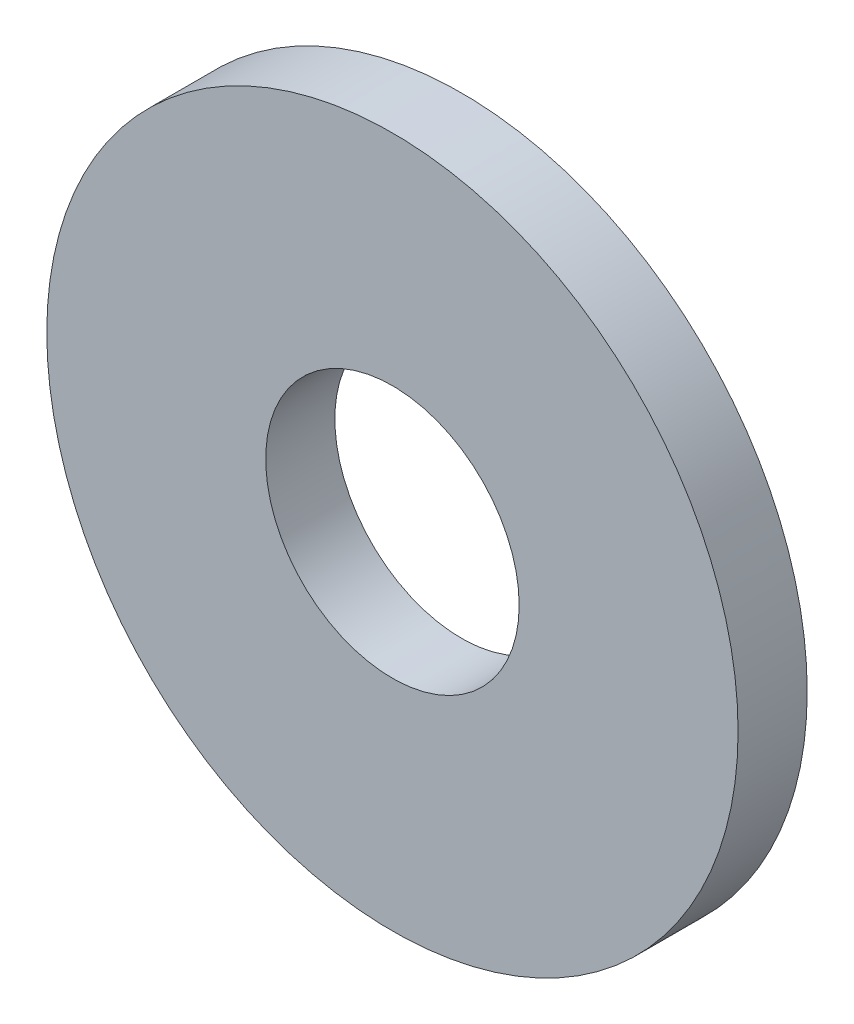
ISO-10303-21;
HEADER;
FILE_DESCRIPTION(('STEP AP214'),'2;1');
FILE_NAME('part.step','',(''),(''),'','','');
FILE_SCHEMA(('AUTOMOTIVE_DESIGN { 1 0 10303 214 1 1 1 1 }'));
ENDSEC;
DATA;
#1=APPLICATION_CONTEXT('core data for automotive mechanical design processes');
#2=APPLICATION_PROTOCOL_DEFINITION('international standard','automotive_design',2000,#1);
#3=PRODUCT_CONTEXT('',#1,'mechanical');
#4=PRODUCT('Part','Part','',(#3));
#5=PRODUCT_RELATED_PRODUCT_CATEGORY('part','',(#4));
#6=PRODUCT_DEFINITION_FORMATION('','',#4);
#7=PRODUCT_DEFINITION_CONTEXT('part definition',#1,'design');
#8=PRODUCT_DEFINITION('design','',#6,#7);
#9=PRODUCT_DEFINITION_SHAPE('','',#8);
#10=(LENGTH_UNIT() NAMED_UNIT(*) SI_UNIT(.MILLI.,.METRE.));
#11=(NAMED_UNIT(*) PLANE_ANGLE_UNIT() SI_UNIT($,.RADIAN.));
#12=(NAMED_UNIT(*) SI_UNIT($,.STERADIAN.) SOLID_ANGLE_UNIT());
#13=UNCERTAINTY_MEASURE_WITH_UNIT(LENGTH_MEASURE(1.E-05),#10,'distance_accuracy_value','');
#14=(GEOMETRIC_REPRESENTATION_CONTEXT(3) GLOBAL_UNCERTAINTY_ASSIGNED_CONTEXT((#13)) GLOBAL_UNIT_ASSIGNED_CONTEXT((#10,
#11,#12)) REPRESENTATION_CONTEXT('',''));
#15=CARTESIAN_POINT('',(0.,0.,0.));
#16=DIRECTION('',(0.,0.,1.));
#17=DIRECTION('',(1.,0.,0.));
#18=AXIS2_PLACEMENT_3D('',#15,#16,#17);
#19=CARTESIAN_POINT('',(0.,0.,3.));
#20=DIRECTION('',(0.,0.,1.));
#21=DIRECTION('',(1.,0.,0.));
#22=AXIS2_PLACEMENT_3D('',#19,#20,#21);
#23=PLANE('',#22);
#24=CARTESIAN_POINT('',(0.,0.,3.));
#25=DIRECTION('',(0.,0.,1.));
#26=DIRECTION('',(1.,0.,0.));
#27=AXIS2_PLACEMENT_3D('',#24,#25,#26);
#28=CIRCLE('',#27,15.);
#29=CARTESIAN_POINT('',(15.,0.,3.));
#30=VERTEX_POINT('',#29);
#31=EDGE_CURVE('E10',#30,#30,#28,.T.);
#32=ORIENTED_EDGE('',*,*,#31,.T.);
#33=EDGE_LOOP('',(#32));
#34=FACE_BOUND('',#33,.T.);
#35=CARTESIAN_POINT('',(0.,0.,3.));
#36=DIRECTION('',(0.,0.,1.));
#37=DIRECTION('',(1.,0.,0.));
#38=AXIS2_PLACEMENT_3D('',#35,#36,#37);
#39=CIRCLE('',#38,5.5);
#40=CARTESIAN_POINT('',(5.5,0.,3.));
#41=VERTEX_POINT('',#40);
#42=EDGE_CURVE('E63',#41,#41,#39,.T.);
#43=ORIENTED_EDGE('',*,*,#42,.F.);
#44=EDGE_LOOP('',(#43));
#45=FACE_BOUND('',#44,.T.);
#46=ADVANCED_FACE('F49',(#34,#45),#23,.T.);
#47=CARTESIAN_POINT('',(0.,0.,0.));
#48=DIRECTION('',(0.,0.,1.));
#49=DIRECTION('',(1.,0.,0.));
#50=AXIS2_PLACEMENT_3D('',#47,#48,#49);
#51=PLANE('',#50);
#52=CARTESIAN_POINT('',(0.,0.,0.));
#53=DIRECTION('',(0.,0.,1.));
#54=DIRECTION('',(1.,0.,0.));
#55=AXIS2_PLACEMENT_3D('',#52,#53,#54);
#56=CIRCLE('',#55,15.);
#57=CARTESIAN_POINT('',(15.,0.,0.));
#58=VERTEX_POINT('',#57);
#59=EDGE_CURVE('E53',#58,#58,#56,.T.);
#60=ORIENTED_EDGE('',*,*,#59,.F.);
#61=EDGE_LOOP('',(#60));
#62=FACE_BOUND('',#61,.T.);
#63=CARTESIAN_POINT('',(0.,0.,0.));
#64=DIRECTION('',(0.,0.,1.));
#65=DIRECTION('',(1.,0.,0.));
#66=AXIS2_PLACEMENT_3D('',#63,#64,#65);
#67=CIRCLE('',#66,5.5);
#68=CARTESIAN_POINT('',(5.5,0.,0.));
#69=VERTEX_POINT('',#68);
#70=EDGE_CURVE('E65',#69,#69,#67,.T.);
#71=ORIENTED_EDGE('',*,*,#70,.T.);
#72=EDGE_LOOP('',(#71));
#73=FACE_BOUND('',#72,.T.);
#74=ADVANCED_FACE('F78',(#62,#73),#51,.F.);
#75=CARTESIAN_POINT('',(0.,0.,3.));
#76=DIRECTION('',(0.,0.,-1.));
#77=DIRECTION('',(-1.,0.,0.));
#78=AXIS2_PLACEMENT_3D('',#75,#76,#77);
#79=CYLINDRICAL_SURFACE('',#78,15.);
#80=ORIENTED_EDGE('',*,*,#31,.F.);
#81=EDGE_LOOP('',(#80));
#82=FACE_BOUND('',#81,.T.);
#83=ORIENTED_EDGE('',*,*,#59,.T.);
#84=EDGE_LOOP('',(#83));
#85=FACE_BOUND('',#84,.T.);
#86=ADVANCED_FACE('F51',(#82,#85),#79,.T.);
#87=CARTESIAN_POINT('',(0.,0.,3.));
#88=DIRECTION('',(0.,0.,-1.));
#89=DIRECTION('',(-1.,0.,0.));
#90=AXIS2_PLACEMENT_3D('',#87,#88,#89);
#91=CYLINDRICAL_SURFACE('',#90,5.5);
#92=ORIENTED_EDGE('',*,*,#42,.T.);
#93=EDGE_LOOP('',(#92));
#94=FACE_BOUND('',#93,.T.);
#95=ORIENTED_EDGE('',*,*,#70,.F.);
#96=EDGE_LOOP('',(#95));
#97=FACE_BOUND('',#96,.T.);
#98=ADVANCED_FACE('F74',(#94,#97),#91,.F.);
#99=CLOSED_SHELL('',(#46,#74,#86,#98));
#100=MANIFOLD_SOLID_BREP('B2',#99);
#101=ADVANCED_BREP_SHAPE_REPRESENTATION('',(#18,#100),#14);
#102=SHAPE_DEFINITION_REPRESENTATION(#9,#101);
ENDSEC;
END-ISO-10303-21;
